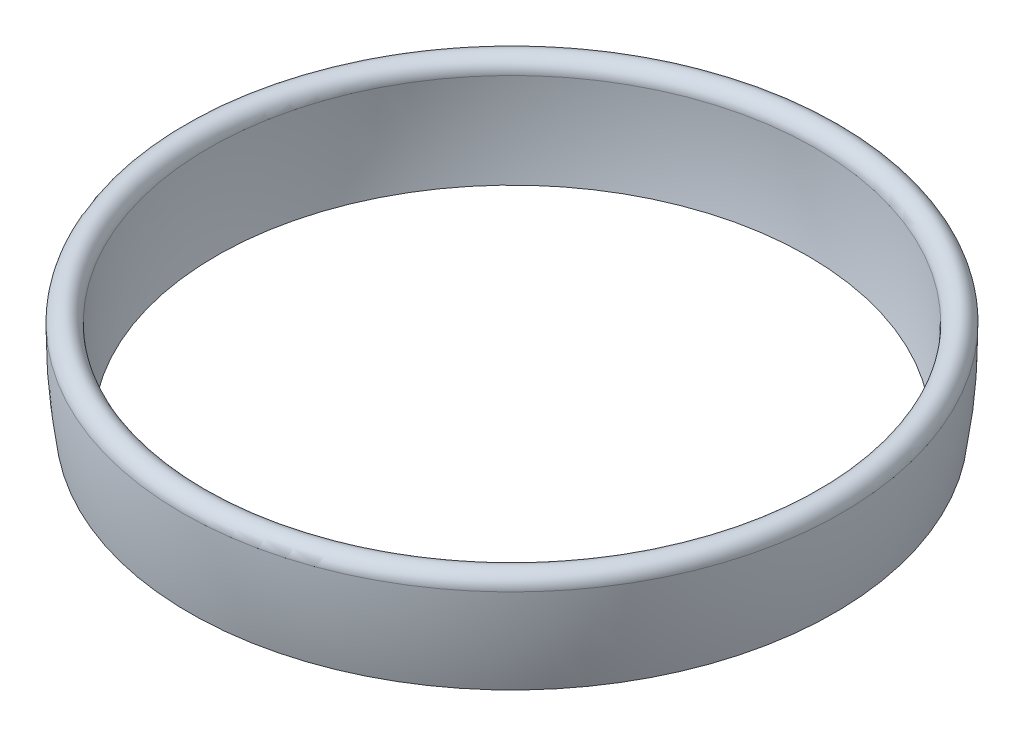
ISO-10303-21;
HEADER;
FILE_DESCRIPTION(('STEP AP214'),'2;1');
FILE_NAME('part.step','',(''),(''),'','','');
FILE_SCHEMA(('AUTOMOTIVE_DESIGN { 1 0 10303 214 1 1 1 1 }'));
ENDSEC;
DATA;
#1=APPLICATION_CONTEXT('core data for automotive mechanical design processes');
#2=APPLICATION_PROTOCOL_DEFINITION('international standard','automotive_design',2000,#1);
#3=PRODUCT_CONTEXT('',#1,'mechanical');
#4=PRODUCT('Part','Part','',(#3));
#5=PRODUCT_RELATED_PRODUCT_CATEGORY('part','',(#4));
#6=PRODUCT_DEFINITION_FORMATION('','',#4);
#7=PRODUCT_DEFINITION_CONTEXT('part definition',#1,'design');
#8=PRODUCT_DEFINITION('design','',#6,#7);
#9=PRODUCT_DEFINITION_SHAPE('','',#8);
#10=(LENGTH_UNIT() NAMED_UNIT(*) SI_UNIT(.MILLI.,.METRE.));
#11=(NAMED_UNIT(*) PLANE_ANGLE_UNIT() SI_UNIT($,.RADIAN.));
#12=(NAMED_UNIT(*) SI_UNIT($,.STERADIAN.) SOLID_ANGLE_UNIT());
#13=UNCERTAINTY_MEASURE_WITH_UNIT(LENGTH_MEASURE(1.E-05),#10,'distance_accuracy_value','');
#14=(GEOMETRIC_REPRESENTATION_CONTEXT(3) GLOBAL_UNCERTAINTY_ASSIGNED_CONTEXT((#13)) GLOBAL_UNIT_ASSIGNED_CONTEXT((#10,
#11,#12)) REPRESENTATION_CONTEXT('',''));
#15=CARTESIAN_POINT('',(0.,0.,0.));
#16=DIRECTION('',(0.,0.,1.));
#17=DIRECTION('',(1.,0.,0.));
#18=AXIS2_PLACEMENT_3D('',#15,#16,#17);
#19=CARTESIAN_POINT('',(0.,115.917975982715,0.));
#20=DIRECTION('',(0.,1.,0.));
#21=DIRECTION('',(0.,0.,1.));
#22=AXIS2_PLACEMENT_3D('',#19,#20,#21);
#23=PLANE('',#22);
#24=CARTESIAN_POINT('',(0.,115.917975982715,0.));
#25=DIRECTION('',(0.,-1.,0.));
#26=DIRECTION('',(0.,0.,-1.));
#27=AXIS2_PLACEMENT_3D('',#24,#25,#26);
#28=CIRCLE('',#27,112.203215086463);
#29=CARTESIAN_POINT('',(0.,115.917975982715,-112.203215086463));
#30=VERTEX_POINT('',#29);
#31=EDGE_CURVE('E42',#30,#30,#28,.F.);
#32=ORIENTED_EDGE('',*,*,#31,.T.);
#33=EDGE_LOOP('',(#32));
#34=FACE_BOUND('',#33,.T.);
#35=CARTESIAN_POINT('',(0.,115.917975982715,0.));
#36=DIRECTION('',(0.,-1.,0.));
#37=DIRECTION('',(0.,0.,-1.));
#38=AXIS2_PLACEMENT_3D('',#35,#36,#37);
#39=CIRCLE('',#38,122.348179271715);
#40=CARTESIAN_POINT('',(0.,115.917975982715,-122.348179271715));
#41=VERTEX_POINT('',#40);
#42=EDGE_CURVE('E10',#41,#41,#39,.T.);
#43=ORIENTED_EDGE('',*,*,#42,.T.);
#44=EDGE_LOOP('',(#43));
#45=FACE_BOUND('',#44,.T.);
#46=ADVANCED_FACE('F39',(#34,#45),#23,.F.);
#47=CARTESIAN_POINT('',(0.,149.979386732983,0.));
#48=DIRECTION('',(0.,-1.,0.));
#49=DIRECTION('',(0.,0.,-1.));
#50=AXIS2_PLACEMENT_3D('',#47,#48,#49);
#51=TOROIDAL_SURFACE('',#50,120.000042490858,5.);
#52=CARTESIAN_POINT('',(0.,149.958773465966,0.));
#53=DIRECTION('',(0.,-1.,0.));
#54=DIRECTION('',(0.,0.,-1.));
#55=AXIS2_PLACEMENT_3D('',#52,#53,#54);
#56=CIRCLE('',#55,115.000084981717);
#57=CARTESIAN_POINT('',(0.,149.958773465966,-115.000084981717));
#58=VERTEX_POINT('',#57);
#59=EDGE_CURVE('E51',#58,#58,#56,.T.);
#60=ORIENTED_EDGE('',*,*,#59,.T.);
#61=EDGE_LOOP('',(#60));
#62=FACE_BOUND('',#61,.T.);
#63=CARTESIAN_POINT('',(0.,150.,0.));
#64=DIRECTION('',(0.,-1.,0.));
#65=DIRECTION('',(0.,0.,-1.));
#66=AXIS2_PLACEMENT_3D('',#63,#64,#65);
#67=CIRCLE('',#66,125.);
#68=CARTESIAN_POINT('',(0.,150.,-125.));
#69=VERTEX_POINT('',#68);
#70=EDGE_CURVE('E56',#69,#69,#67,.T.);
#71=ORIENTED_EDGE('',*,*,#70,.F.);
#72=EDGE_LOOP('',(#71));
#73=FACE_BOUND('',#72,.T.);
#74=ADVANCED_FACE('F75',(#62,#73),#51,.T.);
#75=CARTESIAN_POINT('',(50.,0.,0.));
#76=CARTESIAN_POINT('',(125.379015742053,58.0658779619606,0.));
#77=CARTESIAN_POINT('',(125.,150.,0.));
#78=B_SPLINE_CURVE_WITH_KNOTS('',2,(#75,#76,#77),.UNSPECIFIED.,.F.,.F.,(3,3),(0.,1.),.UNSPECIFIED.);
#79=CARTESIAN_POINT('',(0.,0.,0.));
#80=DIRECTION('',(0.,-1.,0.));
#81=AXIS1_PLACEMENT('',#79,#80);
#82=SURFACE_OF_REVOLUTION('',#78,#81);
#83=ORIENTED_EDGE('',*,*,#42,.F.);
#84=EDGE_LOOP('',(#83));
#85=FACE_BOUND('',#84,.T.);
#86=ORIENTED_EDGE('',*,*,#70,.T.);
#87=EDGE_LOOP('',(#86));
#88=FACE_BOUND('',#87,.T.);
#89=ADVANCED_FACE('F73',(#85,#88),#82,.F.);
#90=CARTESIAN_POINT('',(115.000084981717,149.958773465966,0.));
#91=CARTESIAN_POINT('',(115.061836962495,133.802708915539,0.));
#92=CARTESIAN_POINT('',(110.332325005578,103.946266197447,0.));
#93=CARTESIAN_POINT('',(99.2195496088196,71.8446990028856,0.));
#94=CARTESIAN_POINT('',(80.5767181566497,43.0511340138053,0.));
#95=CARTESIAN_POINT('',(59.6001731691299,20.3567600373069,0.));
#96=CARTESIAN_POINT('',(46.5554426906814,10.0000000000007,0.));
#97=B_SPLINE_CURVE_WITH_KNOTS('',2,(#90,#91,#92,#93,#94,#95,#96),.UNSPECIFIED.,.F.,.F.,(3,1,1,1,
1,3),(0.0185538325224272,0.202574988924472,0.386596145326517,0.63195768719591,0.815978843597955,
1.),.UNSPECIFIED.);
#98=CARTESIAN_POINT('',(0.,0.,0.));
#99=DIRECTION('',(0.,-1.,0.));
#100=AXIS1_PLACEMENT('',#98,#99);
#101=SURFACE_OF_REVOLUTION('',#97,#100);
#102=ORIENTED_EDGE('',*,*,#31,.F.);
#103=EDGE_LOOP('',(#102));
#104=FACE_BOUND('',#103,.T.);
#105=ORIENTED_EDGE('',*,*,#59,.F.);
#106=EDGE_LOOP('',(#105));
#107=FACE_BOUND('',#106,.T.);
#108=ADVANCED_FACE('F70',(#104,#107),#101,.F.);
#109=CLOSED_SHELL('',(#46,#74,#89,#108));
#110=MANIFOLD_SOLID_BREP('B2',#109);
#111=ADVANCED_BREP_SHAPE_REPRESENTATION('',(#18,#110),#14);
#112=SHAPE_DEFINITION_REPRESENTATION(#9,#111);
ENDSEC;
END-ISO-10303-21;
